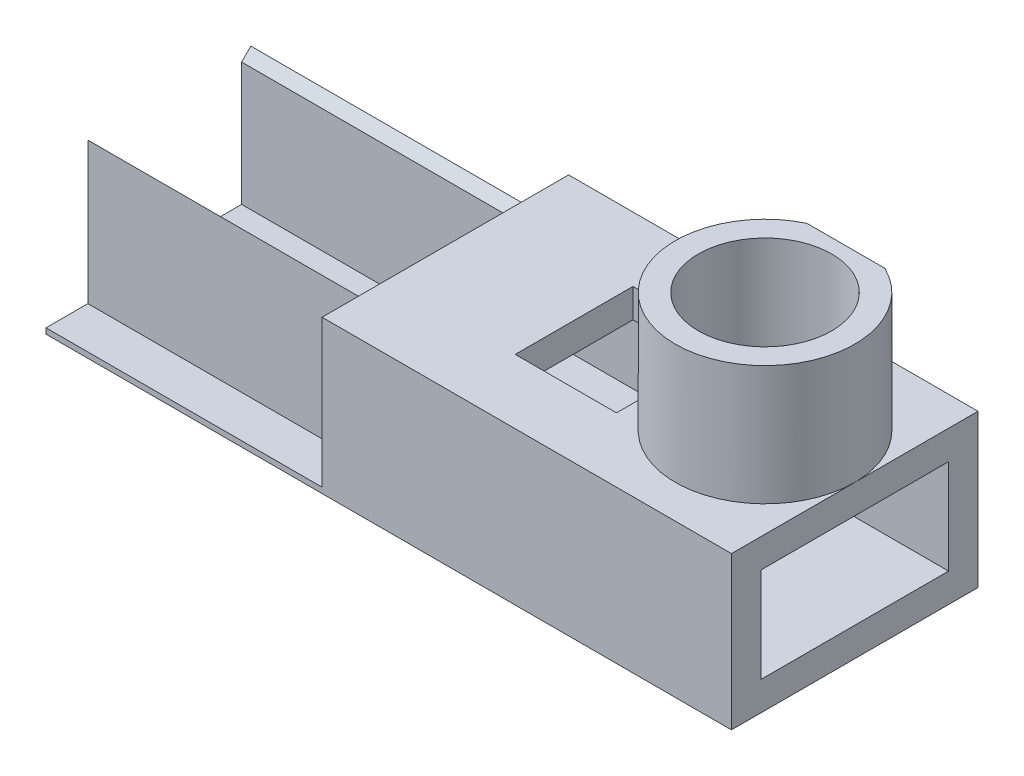
ISO-10303-21;
HEADER;
FILE_DESCRIPTION(('STEP AP214'),'2;1');
FILE_NAME('part.step','',(''),(''),'','','');
FILE_SCHEMA(('AUTOMOTIVE_DESIGN { 1 0 10303 214 1 1 1 1 }'));
ENDSEC;
DATA;
#1=APPLICATION_CONTEXT('core data for automotive mechanical design processes');
#2=APPLICATION_PROTOCOL_DEFINITION('international standard','automotive_design',2000,#1);
#3=PRODUCT_CONTEXT('',#1,'mechanical');
#4=PRODUCT('Part','Part','',(#3));
#5=PRODUCT_RELATED_PRODUCT_CATEGORY('part','',(#4));
#6=PRODUCT_DEFINITION_FORMATION('','',#4);
#7=PRODUCT_DEFINITION_CONTEXT('part definition',#1,'design');
#8=PRODUCT_DEFINITION('design','',#6,#7);
#9=PRODUCT_DEFINITION_SHAPE('','',#8);
#10=(LENGTH_UNIT() NAMED_UNIT(*) SI_UNIT(.MILLI.,.METRE.));
#11=(NAMED_UNIT(*) PLANE_ANGLE_UNIT() SI_UNIT($,.RADIAN.));
#12=(NAMED_UNIT(*) SI_UNIT($,.STERADIAN.) SOLID_ANGLE_UNIT());
#13=UNCERTAINTY_MEASURE_WITH_UNIT(LENGTH_MEASURE(1.E-05),#10,'distance_accuracy_value','');
#14=(GEOMETRIC_REPRESENTATION_CONTEXT(3) GLOBAL_UNCERTAINTY_ASSIGNED_CONTEXT((#13)) GLOBAL_UNIT_ASSIGNED_CONTEXT((#10,
#11,#12)) REPRESENTATION_CONTEXT('',''));
#15=CARTESIAN_POINT('',(0.,0.,0.));
#16=DIRECTION('',(0.,0.,1.));
#17=DIRECTION('',(1.,0.,0.));
#18=AXIS2_PLACEMENT_3D('',#15,#16,#17);
#19=CARTESIAN_POINT('',(19.5,10.5957838415425,-19.2114942528736));
#20=DIRECTION('',(0.,1.,0.));
#21=DIRECTION('',(0.,0.,1.));
#22=AXIS2_PLACEMENT_3D('',#19,#20,#21);
#23=PLANE('',#22);
#24=CARTESIAN_POINT('',(9.75,10.5957838415425,-9.01149425287356));
#25=DIRECTION('',(0.,1.,0.));
#26=DIRECTION('',(0.,0.,1.));
#27=AXIS2_PLACEMENT_3D('',#24,#25,#26);
#28=CIRCLE('',#27,7.2482741471671);
#29=CARTESIAN_POINT('',(9.75,10.5957838415425,-1.76322010570646));
#30=VERTEX_POINT('',#29);
#31=EDGE_CURVE('E301',#30,#30,#28,.T.);
#32=ORIENTED_EDGE('',*,*,#31,.T.);
#33=EDGE_LOOP('',(#32));
#34=FACE_BOUND('',#33,.T.);
#35=DIRECTION('',(1.,0.,0.));
#36=VECTOR('',#35,1.);
#37=CARTESIAN_POINT('',(19.5,10.5957838415425,-2.61149425287356));
#38=LINE('',#37,#36);
#39=CARTESIAN_POINT('',(-11.0041079388008,10.5957838415425,-2.61149425287356));
#40=VERTEX_POINT('',#39);
#41=CARTESIAN_POINT('',(0.,10.5957838415425,-2.61149425287356));
#42=VERTEX_POINT('',#41);
#43=EDGE_CURVE('E311',#40,#42,#38,.T.);
#44=ORIENTED_EDGE('',*,*,#43,.T.);
#45=DIRECTION('',(0.,0.,-1.));
#46=VECTOR('',#45,1.);
#47=CARTESIAN_POINT('',(0.,10.5957838415425,-19.2114942528736));
#48=LINE('',#47,#46);
#49=CARTESIAN_POINT('',(0.,10.5957838415425,-15.4114942528736));
#50=VERTEX_POINT('',#49);
#51=EDGE_CURVE('E314',#42,#50,#48,.T.);
#52=ORIENTED_EDGE('',*,*,#51,.T.);
#53=DIRECTION('',(-1.,0.,0.));
#54=VECTOR('',#53,1.);
#55=CARTESIAN_POINT('',(19.5,10.5957838415425,-15.4114942528736));
#56=LINE('',#55,#54);
#57=CARTESIAN_POINT('',(-11.0041079388008,10.5957838415425,-15.4114942528736));
#58=VERTEX_POINT('',#57);
#59=EDGE_CURVE('E278',#50,#58,#56,.T.);
#60=ORIENTED_EDGE('',*,*,#59,.T.);
#61=DIRECTION('',(0.,0.,1.));
#62=VECTOR('',#61,1.);
#63=CARTESIAN_POINT('',(-11.0041079388008,10.5957838415425,-19.2114942528736));
#64=LINE('',#63,#62);
#65=EDGE_CURVE('E308',#58,#40,#64,.T.);
#66=ORIENTED_EDGE('',*,*,#65,.T.);
#67=EDGE_LOOP('',(#44,#52,#60,#66));
#68=FACE_BOUND('',#67,.T.);
#69=DIRECTION('',(-1.,0.,0.));
#70=VECTOR('',#69,1.);
#71=CARTESIAN_POINT('',(-19.,10.5957838415425,-13.3022949952942));
#72=LINE('',#71,#70);
#73=CARTESIAN_POINT('',(-24.,10.5957838415425,-13.3022949952942));
#74=VERTEX_POINT('',#73);
#75=CARTESIAN_POINT('',(-19.,10.5957838415425,-13.3022949952942));
#76=VERTEX_POINT('',#75);
#77=EDGE_CURVE('E586',#74,#76,#72,.F.);
#78=ORIENTED_EDGE('',*,*,#77,.F.);
#79=DIRECTION('',(0.,0.,-1.));
#80=VECTOR('',#79,1.);
#81=CARTESIAN_POINT('',(-24.,10.5957838415425,-19.2114942528736));
#82=LINE('',#81,#80);
#83=CARTESIAN_POINT('',(-24.,10.5957838415425,-19.2114942528736));
#84=VERTEX_POINT('',#83);
#85=EDGE_CURVE('E532',#74,#84,#82,.T.);
#86=ORIENTED_EDGE('',*,*,#85,.T.);
#87=DIRECTION('',(-1.,0.,0.));
#88=VECTOR('',#87,1.);
#89=CARTESIAN_POINT('',(19.5,10.5957838415425,-19.2114942528736));
#90=LINE('',#89,#88);
#91=CARTESIAN_POINT('',(19.5,10.5957838415425,-19.2114942528736));
#92=VERTEX_POINT('',#91);
#93=EDGE_CURVE('E300',#92,#84,#90,.T.);
#94=ORIENTED_EDGE('',*,*,#93,.F.);
#95=DIRECTION('',(0.,0.,-1.));
#96=VECTOR('',#95,1.);
#97=CARTESIAN_POINT('',(19.5,10.5957838415425,-19.2114942528736));
#98=LINE('',#97,#96);
#99=CARTESIAN_POINT('',(19.5,10.5957838415425,1.18850574712644));
#100=VERTEX_POINT('',#99);
#101=EDGE_CURVE('E546',#100,#92,#98,.T.);
#102=ORIENTED_EDGE('',*,*,#101,.F.);
#103=DIRECTION('',(-1.,0.,0.));
#104=VECTOR('',#103,1.);
#105=CARTESIAN_POINT('',(19.5,10.5957838415425,1.18850574712644));
#106=LINE('',#105,#104);
#107=CARTESIAN_POINT('',(-24.,10.5957838415425,1.18850574712644));
#108=VERTEX_POINT('',#107);
#109=EDGE_CURVE('E552',#100,#108,#106,.T.);
#110=ORIENTED_EDGE('',*,*,#109,.T.);
#111=CARTESIAN_POINT('',(-24.,10.5957838415425,-4.72069351045292));
#112=VERTEX_POINT('',#111);
#113=EDGE_CURVE('E305',#108,#112,#82,.T.);
#114=ORIENTED_EDGE('',*,*,#113,.T.);
#115=DIRECTION('',(-1.,0.,0.));
#116=VECTOR('',#115,1.);
#117=CARTESIAN_POINT('',(-19.,10.5957838415425,-4.72069351045292));
#118=LINE('',#117,#116);
#119=CARTESIAN_POINT('',(-19.,10.5957838415425,-4.72069351045292));
#120=VERTEX_POINT('',#119);
#121=EDGE_CURVE('E581',#120,#112,#118,.T.);
#122=ORIENTED_EDGE('',*,*,#121,.F.);
#123=DIRECTION('',(0.,0.,-1.));
#124=VECTOR('',#123,1.);
#125=CARTESIAN_POINT('',(-19.,10.5957838415425,-19.2114942528736));
#126=LINE('',#125,#124);
#127=EDGE_CURVE('E420',#120,#76,#126,.T.);
#128=ORIENTED_EDGE('',*,*,#127,.T.);
#129=EDGE_LOOP('',(#78,#86,#94,#102,#110,#114,#122,#128));
#130=FACE_BOUND('',#129,.T.);
#131=ADVANCED_FACE('F61',(#34,#68,#130),#23,.F.);
#132=CARTESIAN_POINT('',(19.5,0.29578384154251,-19.2114942528736));
#133=DIRECTION('',(0.,-1.,0.));
#134=DIRECTION('',(0.,0.,-1.));
#135=AXIS2_PLACEMENT_3D('',#132,#133,#134);
#136=PLANE('',#135);
#137=CARTESIAN_POINT('',(-1.24245959291602,0.29578384154251,-9.01149425287356));
#138=DIRECTION('',(0.,-1.,0.));
#139=DIRECTION('',(0.,0.,-1.));
#140=AXIS2_PLACEMENT_3D('',#137,#138,#139);
#141=CIRCLE('',#140,10.);
#142=CARTESIAN_POINT('',(-1.24245959291602,0.29578384154251,-19.0114942528736));
#143=VERTEX_POINT('',#142);
#144=EDGE_CURVE('E317',#143,#143,#141,.T.);
#145=ORIENTED_EDGE('',*,*,#144,.T.);
#146=EDGE_LOOP('',(#145));
#147=FACE_BOUND('',#146,.T.);
#148=DIRECTION('',(-1.,0.,0.));
#149=VECTOR('',#148,1.);
#150=CARTESIAN_POINT('',(-19.,0.29578384154251,-4.72069351045292));
#151=LINE('',#150,#149);
#152=CARTESIAN_POINT('',(-24.,0.29578384154251,-4.72069351045292));
#153=VERTEX_POINT('',#152);
#154=CARTESIAN_POINT('',(-19.,0.29578384154251,-4.72069351045292));
#155=VERTEX_POINT('',#154);
#156=EDGE_CURVE('E578',#153,#155,#151,.F.);
#157=ORIENTED_EDGE('',*,*,#156,.F.);
#158=DIRECTION('',(0.,0.,1.));
#159=VECTOR('',#158,1.);
#160=CARTESIAN_POINT('',(-24.,0.29578384154251,-19.2114942528736));
#161=LINE('',#160,#159);
#162=CARTESIAN_POINT('',(-24.,0.29578384154251,1.18850574712644));
#163=VERTEX_POINT('',#162);
#164=EDGE_CURVE('E525',#153,#163,#161,.T.);
#165=ORIENTED_EDGE('',*,*,#164,.T.);
#166=DIRECTION('',(-1.,0.,0.));
#167=VECTOR('',#166,1.);
#168=CARTESIAN_POINT('',(19.5,0.29578384154251,1.18850574712644));
#169=LINE('',#168,#167);
#170=CARTESIAN_POINT('',(19.5,0.29578384154251,1.18850574712644));
#171=VERTEX_POINT('',#170);
#172=EDGE_CURVE('E555',#171,#163,#169,.T.);
#173=ORIENTED_EDGE('',*,*,#172,.F.);
#174=DIRECTION('',(0.,0.,1.));
#175=VECTOR('',#174,1.);
#176=CARTESIAN_POINT('',(19.5,0.29578384154251,-19.2114942528736));
#177=LINE('',#176,#175);
#178=CARTESIAN_POINT('',(19.5,0.29578384154251,-19.2114942528736));
#179=VERTEX_POINT('',#178);
#180=EDGE_CURVE('E540',#179,#171,#177,.T.);
#181=ORIENTED_EDGE('',*,*,#180,.F.);
#182=DIRECTION('',(-1.,0.,0.));
#183=VECTOR('',#182,1.);
#184=CARTESIAN_POINT('',(19.5,0.29578384154251,-19.2114942528736));
#185=LINE('',#184,#183);
#186=CARTESIAN_POINT('',(-24.,0.29578384154251,-19.2114942528736));
#187=VERTEX_POINT('',#186);
#188=EDGE_CURVE('E549',#179,#187,#185,.T.);
#189=ORIENTED_EDGE('',*,*,#188,.T.);
#190=CARTESIAN_POINT('',(-24.,0.29578384154251,-13.3022949952942));
#191=VERTEX_POINT('',#190);
#192=EDGE_CURVE('E526',#187,#191,#161,.T.);
#193=ORIENTED_EDGE('',*,*,#192,.T.);
#194=DIRECTION('',(-1.,0.,0.));
#195=VECTOR('',#194,1.);
#196=CARTESIAN_POINT('',(-19.,0.29578384154251,-13.3022949952942));
#197=LINE('',#196,#195);
#198=CARTESIAN_POINT('',(-19.,0.29578384154251,-13.3022949952942));
#199=VERTEX_POINT('',#198);
#200=EDGE_CURVE('E574',#199,#191,#197,.T.);
#201=ORIENTED_EDGE('',*,*,#200,.F.);
#202=DIRECTION('',(0.,0.,1.));
#203=VECTOR('',#202,1.);
#204=CARTESIAN_POINT('',(-19.,0.29578384154251,-19.2114942528736));
#205=LINE('',#204,#203);
#206=EDGE_CURVE('E323',#199,#155,#205,.T.);
#207=ORIENTED_EDGE('',*,*,#206,.T.);
#208=EDGE_LOOP('',(#157,#165,#173,#181,#189,#193,#201,#207));
#209=FACE_BOUND('',#208,.T.);
#210=ADVANCED_FACE('F336',(#147,#209),#136,.F.);
#211=CARTESIAN_POINT('',(19.5,0.,0.));
#212=DIRECTION('',(-1.,0.,0.));
#213=DIRECTION('',(0.,0.,1.));
#214=AXIS2_PLACEMENT_3D('',#211,#212,#213);
#215=PLANE('',#214);
#216=DIRECTION('',(0.,0.,-1.));
#217=VECTOR('',#216,1.);
#218=CARTESIAN_POINT('',(19.5,-2.85421615845749,4.38850574712644));
#219=LINE('',#218,#217);
#220=CARTESIAN_POINT('',(19.5,-2.85421615845749,4.38850574712644));
#221=VERTEX_POINT('',#220);
#222=CARTESIAN_POINT('',(19.5,-2.85421615845749,-22.4114942528736));
#223=VERTEX_POINT('',#222);
#224=EDGE_CURVE('E266',#221,#223,#219,.T.);
#225=ORIENTED_EDGE('',*,*,#224,.T.);
#226=DIRECTION('',(0.,-1.,0.));
#227=VECTOR('',#226,1.);
#228=CARTESIAN_POINT('',(19.5,13.7457838415425,-22.4114942528736));
#229=LINE('',#228,#227);
#230=CARTESIAN_POINT('',(19.5,13.7457838415425,-22.4114942528736));
#231=VERTEX_POINT('',#230);
#232=EDGE_CURVE('E269',#231,#223,#229,.T.);
#233=ORIENTED_EDGE('',*,*,#232,.F.);
#234=DIRECTION('',(0.,0.,-1.));
#235=VECTOR('',#234,1.);
#236=CARTESIAN_POINT('',(19.5,13.7457838415425,4.38850574712644));
#237=LINE('',#236,#235);
#238=CARTESIAN_POINT('',(19.5,13.7457838415425,-9.01149425287356));
#239=VERTEX_POINT('',#238);
#240=EDGE_CURVE('E283',#239,#231,#237,.T.);
#241=ORIENTED_EDGE('',*,*,#240,.F.);
#242=CARTESIAN_POINT('',(19.5,13.7457838415425,4.38850574712644));
#243=VERTEX_POINT('',#242);
#244=EDGE_CURVE('E284',#243,#239,#237,.T.);
#245=ORIENTED_EDGE('',*,*,#244,.F.);
#246=DIRECTION('',(0.,-1.,0.));
#247=VECTOR('',#246,1.);
#248=CARTESIAN_POINT('',(19.5,13.7457838415425,4.38850574712644));
#249=LINE('',#248,#247);
#250=EDGE_CURVE('E287',#243,#221,#249,.T.);
#251=ORIENTED_EDGE('',*,*,#250,.T.);
#252=EDGE_LOOP('',(#225,#233,#241,#245,#251));
#253=FACE_BOUND('',#252,.T.);
#254=ORIENTED_EDGE('',*,*,#101,.T.);
#255=DIRECTION('',(0.,-1.,0.));
#256=VECTOR('',#255,1.);
#257=CARTESIAN_POINT('',(19.5,10.5957838415425,-19.2114942528736));
#258=LINE('',#257,#256);
#259=EDGE_CURVE('E537',#92,#179,#258,.T.);
#260=ORIENTED_EDGE('',*,*,#259,.T.);
#261=ORIENTED_EDGE('',*,*,#180,.T.);
#262=DIRECTION('',(0.,1.,0.));
#263=VECTOR('',#262,1.);
#264=CARTESIAN_POINT('',(19.5,10.5957838415425,1.18850574712644));
#265=LINE('',#264,#263);
#266=EDGE_CURVE('E543',#171,#100,#265,.T.);
#267=ORIENTED_EDGE('',*,*,#266,.T.);
#268=EDGE_LOOP('',(#254,#260,#261,#267));
#269=FACE_BOUND('',#268,.T.);
#270=ADVANCED_FACE('F342',(#253,#269),#215,.F.);
#271=CARTESIAN_POINT('',(19.5,-2.85421615845749,4.38850574712644));
#272=DIRECTION('',(0.,1.,0.));
#273=DIRECTION('',(0.,0.,1.));
#274=AXIS2_PLACEMENT_3D('',#271,#272,#273);
#275=PLANE('',#274);
#276=CARTESIAN_POINT('',(-1.24245959291602,-2.85421615845749,-9.01149425287356));
#277=DIRECTION('',(0.,-1.,0.));
#278=DIRECTION('',(0.,0.,-1.));
#279=AXIS2_PLACEMENT_3D('',#276,#277,#278);
#280=CIRCLE('',#279,8.);
#281=CARTESIAN_POINT('',(-1.24245959291602,-2.85421615845749,-17.0114942528736));
#282=VERTEX_POINT('',#281);
#283=EDGE_CURVE('E392',#282,#282,#280,.T.);
#284=ORIENTED_EDGE('',*,*,#283,.F.);
#285=EDGE_LOOP('',(#284));
#286=FACE_BOUND('',#285,.T.);
#287=DIRECTION('',(-1.,0.,0.));
#288=VECTOR('',#287,1.);
#289=CARTESIAN_POINT('',(19.5,-2.85421615845749,4.38850574712644));
#290=LINE('',#289,#288);
#291=CARTESIAN_POINT('',(-55.0112617718967,-2.85421615845749,4.38850574712643));
#292=VERTEX_POINT('',#291);
#293=EDGE_CURVE('E289',#221,#292,#290,.T.);
#294=ORIENTED_EDGE('',*,*,#293,.T.);
#295=DIRECTION('',(0.,0.,-1.));
#296=VECTOR('',#295,1.);
#297=CARTESIAN_POINT('',(-55.0112617718967,-2.85421615845749,4.38850574712643));
#298=LINE('',#297,#296);
#299=CARTESIAN_POINT('',(-55.0112617718967,-2.85421615845749,-22.4114942528736));
#300=VERTEX_POINT('',#299);
#301=EDGE_CURVE('E399',#292,#300,#298,.T.);
#302=ORIENTED_EDGE('',*,*,#301,.T.);
#303=DIRECTION('',(-1.,0.,0.));
#304=VECTOR('',#303,1.);
#305=CARTESIAN_POINT('',(19.5,-2.85421615845749,-22.4114942528736));
#306=LINE('',#305,#304);
#307=EDGE_CURVE('E296',#223,#300,#306,.T.);
#308=ORIENTED_EDGE('',*,*,#307,.F.);
#309=ORIENTED_EDGE('',*,*,#224,.F.);
#310=EDGE_LOOP('',(#294,#302,#308,#309));
#311=FACE_BOUND('',#310,.T.);
#312=ADVANCED_FACE('F373',(#286,#311),#275,.F.);
#313=CARTESIAN_POINT('',(19.5,13.7457838415425,-22.4114942528736));
#314=DIRECTION('',(0.,0.,-1.));
#315=DIRECTION('',(0.,1.,0.));
#316=AXIS2_PLACEMENT_3D('',#313,#314,#315);
#317=PLANE('',#316);
#318=ORIENTED_EDGE('',*,*,#307,.T.);
#319=DIRECTION('',(0.,1.,0.));
#320=VECTOR('',#319,1.);
#321=CARTESIAN_POINT('',(-55.0112617718967,-2.85421615845749,-22.4114942528736));
#322=LINE('',#321,#320);
#323=CARTESIAN_POINT('',(-55.0112617718967,-2.25421615845749,-22.4114942528736));
#324=VERTEX_POINT('',#323);
#325=EDGE_CURVE('E409',#300,#324,#322,.T.);
#326=ORIENTED_EDGE('',*,*,#325,.T.);
#327=DIRECTION('',(1.,0.,0.));
#328=VECTOR('',#327,1.);
#329=CARTESIAN_POINT('',(-25.,-2.25421615845749,-22.4114942528736));
#330=LINE('',#329,#328);
#331=CARTESIAN_POINT('',(-25.,-2.25421615845749,-22.4114942528736));
#332=VERTEX_POINT('',#331);
#333=EDGE_CURVE('E413',#324,#332,#330,.T.);
#334=ORIENTED_EDGE('',*,*,#333,.T.);
#335=DIRECTION('',(0.,-1.,0.));
#336=VECTOR('',#335,1.);
#337=CARTESIAN_POINT('',(-25.,13.7457838415425,-22.4114942528736));
#338=LINE('',#337,#336);
#339=CARTESIAN_POINT('',(-25.,13.7457838415425,-22.4114942528736));
#340=VERTEX_POINT('',#339);
#341=EDGE_CURVE('E491',#340,#332,#338,.T.);
#342=ORIENTED_EDGE('',*,*,#341,.F.);
#343=DIRECTION('',(-1.,0.,0.));
#344=VECTOR('',#343,1.);
#345=CARTESIAN_POINT('',(19.5,13.7457838415425,-22.4114942528736));
#346=LINE('',#345,#344);
#347=EDGE_CURVE('E294',#231,#340,#346,.T.);
#348=ORIENTED_EDGE('',*,*,#347,.F.);
#349=ORIENTED_EDGE('',*,*,#232,.T.);
#350=EDGE_LOOP('',(#318,#326,#334,#342,#348,#349));
#351=FACE_BOUND('',#350,.T.);
#352=ADVANCED_FACE('F381',(#351),#317,.T.);
#353=CARTESIAN_POINT('',(19.5,13.7457838415425,4.38850574712644));
#354=DIRECTION('',(0.,1.,0.));
#355=DIRECTION('',(0.,0.,1.));
#356=AXIS2_PLACEMENT_3D('',#353,#354,#355);
#357=PLANE('',#356);
#358=DIRECTION('',(0.,0.,-1.));
#359=VECTOR('',#358,1.);
#360=CARTESIAN_POINT('',(0.,13.7457838415425,-15.4114942528736));
#361=LINE('',#360,#359);
#362=CARTESIAN_POINT('',(0.,13.7457838415425,-2.61149425287356));
#363=VERTEX_POINT('',#362);
#364=CARTESIAN_POINT('',(0.,13.7457838415425,-9.01149425287355));
#365=VERTEX_POINT('',#364);
#366=EDGE_CURVE('E502',#363,#365,#361,.T.);
#367=ORIENTED_EDGE('',*,*,#366,.F.);
#368=DIRECTION('',(1.,0.,0.));
#369=VECTOR('',#368,1.);
#370=CARTESIAN_POINT('',(0.,13.7457838415425,-2.61149425287356));
#371=LINE('',#370,#369);
#372=CARTESIAN_POINT('',(-11.0041079388008,13.7457838415425,-2.61149425287356));
#373=VERTEX_POINT('',#372);
#374=EDGE_CURVE('E510',#373,#363,#371,.T.);
#375=ORIENTED_EDGE('',*,*,#374,.F.);
#376=DIRECTION('',(0.,0.,1.));
#377=VECTOR('',#376,1.);
#378=CARTESIAN_POINT('',(-11.0041079388008,13.7457838415425,-15.4114942528736));
#379=LINE('',#378,#377);
#380=CARTESIAN_POINT('',(-11.0041079388008,13.7457838415425,-15.4114942528736));
#381=VERTEX_POINT('',#380);
#382=EDGE_CURVE('E507',#381,#373,#379,.T.);
#383=ORIENTED_EDGE('',*,*,#382,.F.);
#384=DIRECTION('',(-1.,0.,0.));
#385=VECTOR('',#384,1.);
#386=CARTESIAN_POINT('',(0.,13.7457838415425,-15.4114942528736));
#387=LINE('',#386,#385);
#388=CARTESIAN_POINT('',(0.,13.7457838415425,-15.4114942528736));
#389=VERTEX_POINT('',#388);
#390=EDGE_CURVE('E504',#389,#381,#387,.T.);
#391=ORIENTED_EDGE('',*,*,#390,.F.);
#392=EDGE_CURVE('E501',#365,#389,#361,.T.);
#393=ORIENTED_EDGE('',*,*,#392,.F.);
#394=CARTESIAN_POINT('',(9.75,13.7457838415425,-9.01149425287356));
#395=DIRECTION('',(0.,1.,0.));
#396=DIRECTION('',(0.,0.,1.));
#397=AXIS2_PLACEMENT_3D('',#394,#395,#396);
#398=CIRCLE('',#397,9.75);
#399=EDGE_CURVE('E276',#239,#365,#398,.T.);
#400=ORIENTED_EDGE('',*,*,#399,.F.);
#401=ORIENTED_EDGE('',*,*,#240,.T.);
#402=ORIENTED_EDGE('',*,*,#347,.T.);
#403=DIRECTION('',(0.,0.,-1.));
#404=VECTOR('',#403,1.);
#405=CARTESIAN_POINT('',(-25.,13.7457838415425,-22.4114942528736));
#406=LINE('',#405,#404);
#407=CARTESIAN_POINT('',(-25.,13.7457838415425,4.38850574712643));
#408=VERTEX_POINT('',#407);
#409=EDGE_CURVE('E498',#408,#340,#406,.T.);
#410=ORIENTED_EDGE('',*,*,#409,.F.);
#411=DIRECTION('',(-1.,0.,0.));
#412=VECTOR('',#411,1.);
#413=CARTESIAN_POINT('',(19.5,13.7457838415425,4.38850574712644));
#414=LINE('',#413,#412);
#415=EDGE_CURVE('E291',#243,#408,#414,.T.);
#416=ORIENTED_EDGE('',*,*,#415,.F.);
#417=ORIENTED_EDGE('',*,*,#244,.T.);
#418=EDGE_CURVE('E279',#365,#239,#398,.T.);
#419=ORIENTED_EDGE('',*,*,#418,.F.);
#420=EDGE_LOOP('',(#367,#375,#383,#391,#393,#400,#401,#402,#410,#416,#417,#419));
#421=FACE_BOUND('',#420,.T.);
#422=ADVANCED_FACE('F377',(#421),#357,.T.);
#423=CARTESIAN_POINT('',(19.5,13.7457838415425,4.38850574712644));
#424=DIRECTION('',(0.,0.,-1.));
#425=DIRECTION('',(0.,1.,0.));
#426=AXIS2_PLACEMENT_3D('',#423,#424,#425);
#427=PLANE('',#426);
#428=ORIENTED_EDGE('',*,*,#415,.T.);
#429=DIRECTION('',(0.,1.,0.));
#430=VECTOR('',#429,1.);
#431=CARTESIAN_POINT('',(-25.,13.7457838415425,4.38850574712643));
#432=LINE('',#431,#430);
#433=CARTESIAN_POINT('',(-25.,-2.25421615845749,4.38850574712644));
#434=VERTEX_POINT('',#433);
#435=EDGE_CURVE('E496',#434,#408,#432,.T.);
#436=ORIENTED_EDGE('',*,*,#435,.F.);
#437=DIRECTION('',(-1.,0.,0.));
#438=VECTOR('',#437,1.);
#439=CARTESIAN_POINT('',(-25.,-2.25421615845749,4.38850574712644));
#440=LINE('',#439,#438);
#441=CARTESIAN_POINT('',(-55.0112617718967,-2.25421615845749,4.38850574712643));
#442=VERTEX_POINT('',#441);
#443=EDGE_CURVE('E405',#434,#442,#440,.T.);
#444=ORIENTED_EDGE('',*,*,#443,.T.);
#445=DIRECTION('',(0.,1.,0.));
#446=VECTOR('',#445,1.);
#447=CARTESIAN_POINT('',(-55.0112617718967,-2.85421615845749,4.38850574712643));
#448=LINE('',#447,#446);
#449=EDGE_CURVE('E403',#292,#442,#448,.T.);
#450=ORIENTED_EDGE('',*,*,#449,.F.);
#451=ORIENTED_EDGE('',*,*,#293,.F.);
#452=ORIENTED_EDGE('',*,*,#250,.F.);
#453=EDGE_LOOP('',(#428,#436,#444,#450,#451,#452));
#454=FACE_BOUND('',#453,.T.);
#455=ADVANCED_FACE('F368',(#454),#427,.F.);
#456=CARTESIAN_POINT('',(9.75,26.7562663294774,-9.01149425287356));
#457=DIRECTION('',(0.,1.,0.));
#458=DIRECTION('',(0.,0.,1.));
#459=AXIS2_PLACEMENT_3D('',#456,#457,#458);
#460=PLANE('',#459);
#461=DIRECTION('',(1.,0.,0.));
#462=VECTOR('',#461,1.);
#463=CARTESIAN_POINT('',(0.,26.7562663294774,-17.7942021687245));
#464=LINE('',#463,#462);
#465=CARTESIAN_POINT('',(5.51602531126493,26.7562663294774,-17.7942021687245));
#466=VERTEX_POINT('',#465);
#467=CARTESIAN_POINT('',(13.9839746887351,26.7562663294774,-17.7942021687245));
#468=VERTEX_POINT('',#467);
#469=EDGE_CURVE('E253',#466,#468,#464,.T.);
#470=ORIENTED_EDGE('',*,*,#469,.F.);
#471=CARTESIAN_POINT('',(9.75,26.7562663294774,-9.01149425287356));
#472=DIRECTION('',(0.,1.,0.));
#473=DIRECTION('',(0.,0.,1.));
#474=AXIS2_PLACEMENT_3D('',#471,#472,#473);
#475=CIRCLE('',#474,9.75);
#476=EDGE_CURVE('E262',#466,#468,#475,.T.);
#477=ORIENTED_EDGE('',*,*,#476,.T.);
#478=EDGE_LOOP('',(#470,#477));
#479=FACE_BOUND('',#478,.T.);
#480=CARTESIAN_POINT('',(9.75,26.7562663294774,-9.01149425287356));
#481=DIRECTION('',(0.,1.,0.));
#482=DIRECTION('',(0.,0.,1.));
#483=AXIS2_PLACEMENT_3D('',#480,#481,#482);
#484=CIRCLE('',#483,7.25);
#485=CARTESIAN_POINT('',(9.75,26.7562663294774,-1.76149425287356));
#486=VERTEX_POINT('',#485);
#487=EDGE_CURVE('E267',#486,#486,#484,.T.);
#488=ORIENTED_EDGE('',*,*,#487,.F.);
#489=EDGE_LOOP('',(#488));
#490=FACE_BOUND('',#489,.T.);
#491=ADVANCED_FACE('F260',(#479,#490),#460,.T.);
#492=CARTESIAN_POINT('',(9.75,26.7562663294774,-9.01149425287356));
#493=DIRECTION('',(0.,-1.,0.));
#494=DIRECTION('',(0.,0.,-1.));
#495=AXIS2_PLACEMENT_3D('',#492,#493,#494);
#496=CYLINDRICAL_SURFACE('',#495,9.75);
#497=ORIENTED_EDGE('',*,*,#476,.F.);
#498=DIRECTION('',(0.,-1.,0.));
#499=VECTOR('',#498,1.);
#500=CARTESIAN_POINT('',(5.51602531126493,26.7562663294774,-17.7942021687245));
#501=LINE('',#500,#499);
#502=CARTESIAN_POINT('',(5.51602531126493,13.7462663294774,-17.7942021687245));
#503=VERTEX_POINT('',#502);
#504=EDGE_CURVE('E12',#466,#503,#501,.T.);
#505=ORIENTED_EDGE('',*,*,#504,.T.);
#506=CARTESIAN_POINT('',(9.75,13.7462663294774,-9.01149425287356));
#507=DIRECTION('',(0.,1.,0.));
#508=DIRECTION('',(0.,0.,1.));
#509=AXIS2_PLACEMENT_3D('',#506,#507,#508);
#510=CIRCLE('',#509,9.75);
#511=CARTESIAN_POINT('',(13.9839746887351,13.7462663294774,-17.7942021687245));
#512=VERTEX_POINT('',#511);
#513=EDGE_CURVE('E326',#512,#503,#510,.T.);
#514=ORIENTED_EDGE('',*,*,#513,.F.);
#515=DIRECTION('',(0.,-1.,0.));
#516=VECTOR('',#515,1.);
#517=CARTESIAN_POINT('',(13.9839746887351,26.7562663294774,-17.7942021687245));
#518=LINE('',#517,#516);
#519=EDGE_CURVE('E70',#512,#468,#518,.F.);
#520=ORIENTED_EDGE('',*,*,#519,.T.);
#521=EDGE_LOOP('',(#497,#505,#514,#520));
#522=FACE_BOUND('',#521,.T.);
#523=ORIENTED_EDGE('',*,*,#399,.T.);
#524=ORIENTED_EDGE('',*,*,#418,.T.);
#525=EDGE_LOOP('',(#523,#524));
#526=FACE_BOUND('',#525,.T.);
#527=ADVANCED_FACE('F264',(#522,#526),#496,.T.);
#528=CARTESIAN_POINT('',(9.75,26.7562663294774,-9.01149425287356));
#529=DIRECTION('',(0.,-1.,0.));
#530=DIRECTION('',(0.,0.,-1.));
#531=AXIS2_PLACEMENT_3D('',#528,#529,#530);
#532=CYLINDRICAL_SURFACE('',#531,7.25);
#533=ORIENTED_EDGE('',*,*,#487,.T.);
#534=EDGE_LOOP('',(#533));
#535=FACE_BOUND('',#534,.T.);
#536=CARTESIAN_POINT('',(9.75,10.7457838415425,-9.01149425287356));
#537=DIRECTION('',(0.,1.,0.));
#538=DIRECTION('',(0.,0.,1.));
#539=AXIS2_PLACEMENT_3D('',#536,#537,#538);
#540=CIRCLE('',#539,7.25);
#541=CARTESIAN_POINT('',(9.75,10.7457838415425,-1.76149425287355));
#542=VERTEX_POINT('',#541);
#543=EDGE_CURVE('E272',#542,#542,#540,.T.);
#544=ORIENTED_EDGE('',*,*,#543,.F.);
#545=EDGE_LOOP('',(#544));
#546=FACE_BOUND('',#545,.T.);
#547=ADVANCED_FACE('F361',(#535,#546),#532,.F.);
#548=CARTESIAN_POINT('',(19.5,10.7457838415425,-19.4114942528736));
#549=DIRECTION('',(0.,1.,0.));
#550=DIRECTION('',(0.,0.,1.));
#551=AXIS2_PLACEMENT_3D('',#548,#549,#550);
#552=PLANE('',#551);
#553=CARTESIAN_POINT('',(9.75,10.7457838415425,-9.01149425287356));
#554=DIRECTION('',(0.,1.,0.));
#555=DIRECTION('',(0.,0.,1.));
#556=AXIS2_PLACEMENT_3D('',#553,#554,#555);
#557=CIRCLE('',#556,7.2482741471671);
#558=CARTESIAN_POINT('',(9.75,10.7457838415425,-1.76322010570646));
#559=VERTEX_POINT('',#558);
#560=EDGE_CURVE('E304',#559,#559,#557,.T.);
#561=ORIENTED_EDGE('',*,*,#560,.F.);
#562=EDGE_LOOP('',(#561));
#563=FACE_BOUND('',#562,.T.);
#564=ORIENTED_EDGE('',*,*,#543,.T.);
#565=EDGE_LOOP('',(#564));
#566=FACE_BOUND('',#565,.T.);
#567=ADVANCED_FACE('F357',(#563,#566),#552,.T.);
#568=CARTESIAN_POINT('',(19.5,10.5957838415425,-19.2114942528736));
#569=DIRECTION('',(0.,0.,-1.));
#570=DIRECTION('',(-1.,0.,0.));
#571=AXIS2_PLACEMENT_3D('',#568,#569,#570);
#572=PLANE('',#571);
#573=ORIENTED_EDGE('',*,*,#93,.T.);
#574=DIRECTION('',(0.,-1.,0.));
#575=VECTOR('',#574,1.);
#576=CARTESIAN_POINT('',(-24.,10.5957838415425,-19.2114942528736));
#577=LINE('',#576,#575);
#578=EDGE_CURVE('E522',#84,#187,#577,.T.);
#579=ORIENTED_EDGE('',*,*,#578,.T.);
#580=ORIENTED_EDGE('',*,*,#188,.F.);
#581=ORIENTED_EDGE('',*,*,#259,.F.);
#582=EDGE_LOOP('',(#573,#579,#580,#581));
#583=FACE_BOUND('',#582,.T.);
#584=ADVANCED_FACE('F352',(#583),#572,.F.);
#585=CARTESIAN_POINT('',(19.5,10.5957838415425,1.18850574712644));
#586=DIRECTION('',(0.,0.,1.));
#587=DIRECTION('',(1.,0.,0.));
#588=AXIS2_PLACEMENT_3D('',#585,#586,#587);
#589=PLANE('',#588);
#590=ORIENTED_EDGE('',*,*,#172,.T.);
#591=DIRECTION('',(0.,1.,0.));
#592=VECTOR('',#591,1.);
#593=CARTESIAN_POINT('',(-24.,10.5957838415425,1.18850574712644));
#594=LINE('',#593,#592);
#595=EDGE_CURVE('E529',#163,#108,#594,.T.);
#596=ORIENTED_EDGE('',*,*,#595,.T.);
#597=ORIENTED_EDGE('',*,*,#109,.F.);
#598=ORIENTED_EDGE('',*,*,#266,.F.);
#599=EDGE_LOOP('',(#590,#596,#597,#598));
#600=FACE_BOUND('',#599,.T.);
#601=ADVANCED_FACE('F350',(#600),#589,.F.);
#602=CARTESIAN_POINT('',(9.75,9.74578384154251,-9.01149425287356));
#603=DIRECTION('',(0.,1.,0.));
#604=DIRECTION('',(0.,0.,1.));
#605=AXIS2_PLACEMENT_3D('',#602,#603,#604);
#606=CYLINDRICAL_SURFACE('',#605,7.2482741471671);
#607=ORIENTED_EDGE('',*,*,#560,.T.);
#608=EDGE_LOOP('',(#607));
#609=FACE_BOUND('',#608,.T.);
#610=ORIENTED_EDGE('',*,*,#31,.F.);
#611=EDGE_LOOP('',(#610));
#612=FACE_BOUND('',#611,.T.);
#613=ADVANCED_FACE('F348',(#609,#612),#606,.F.);
#614=CARTESIAN_POINT('',(-1.24245959291602,2.14578384154251,-9.01149425287356));
#615=DIRECTION('',(0.,-1.,0.));
#616=DIRECTION('',(0.,0.,-1.));
#617=AXIS2_PLACEMENT_3D('',#614,#615,#616);
#618=CYLINDRICAL_SURFACE('',#617,8.);
#619=CARTESIAN_POINT('',(-1.24245959291602,-1.7042161584575,-9.01149425287356));
#620=DIRECTION('',(0.,-1.,0.));
#621=DIRECTION('',(0.,0.,-1.));
#622=AXIS2_PLACEMENT_3D('',#619,#620,#621);
#623=CIRCLE('',#622,8.);
#624=CARTESIAN_POINT('',(-1.24245959291602,-1.7042161584575,-17.0114942528736));
#625=VERTEX_POINT('',#624);
#626=EDGE_CURVE('E320',#625,#625,#623,.F.);
#627=ORIENTED_EDGE('',*,*,#626,.T.);
#628=EDGE_LOOP('',(#627));
#629=FACE_BOUND('',#628,.T.);
#630=ORIENTED_EDGE('',*,*,#283,.T.);
#631=EDGE_LOOP('',(#630));
#632=FACE_BOUND('',#631,.T.);
#633=ADVANCED_FACE('F684',(#629,#632),#618,.F.);
#634=CARTESIAN_POINT('',(0.,8.74578384154251,-15.4114942528736));
#635=DIRECTION('',(1.,0.,0.));
#636=DIRECTION('',(0.,0.,-1.));
#637=AXIS2_PLACEMENT_3D('',#634,#635,#636);
#638=PLANE('',#637);
#639=DIRECTION('',(0.,1.,0.));
#640=VECTOR('',#639,1.);
#641=CARTESIAN_POINT('',(0.,8.74578384154251,-2.61149425287356));
#642=LINE('',#641,#640);
#643=EDGE_CURVE('E514',#42,#363,#642,.T.);
#644=ORIENTED_EDGE('',*,*,#643,.T.);
#645=ORIENTED_EDGE('',*,*,#366,.T.);
#646=ORIENTED_EDGE('',*,*,#392,.T.);
#647=DIRECTION('',(0.,1.,0.));
#648=VECTOR('',#647,1.);
#649=CARTESIAN_POINT('',(0.,8.74578384154251,-15.4114942528736));
#650=LINE('',#649,#648);
#651=EDGE_CURVE('E513',#50,#389,#650,.T.);
#652=ORIENTED_EDGE('',*,*,#651,.F.);
#653=ORIENTED_EDGE('',*,*,#51,.F.);
#654=EDGE_LOOP('',(#644,#645,#646,#652,#653));
#655=FACE_BOUND('',#654,.T.);
#656=ADVANCED_FACE('F674',(#655),#638,.F.);
#657=CARTESIAN_POINT('',(0.,8.74578384154251,-2.61149425287356));
#658=DIRECTION('',(0.,0.,1.));
#659=DIRECTION('',(1.,0.,0.));
#660=AXIS2_PLACEMENT_3D('',#657,#658,#659);
#661=PLANE('',#660);
#662=DIRECTION('',(0.,1.,0.));
#663=VECTOR('',#662,1.);
#664=CARTESIAN_POINT('',(-11.0041079388008,8.74578384154251,-2.61149425287356));
#665=LINE('',#664,#663);
#666=EDGE_CURVE('E516',#40,#373,#665,.T.);
#667=ORIENTED_EDGE('',*,*,#666,.T.);
#668=ORIENTED_EDGE('',*,*,#374,.T.);
#669=ORIENTED_EDGE('',*,*,#643,.F.);
#670=ORIENTED_EDGE('',*,*,#43,.F.);
#671=EDGE_LOOP('',(#667,#668,#669,#670));
#672=FACE_BOUND('',#671,.T.);
#673=ADVANCED_FACE('F670',(#672),#661,.F.);
#674=CARTESIAN_POINT('',(-11.0041079388008,8.74578384154251,-15.4114942528736));
#675=DIRECTION('',(-1.,0.,0.));
#676=DIRECTION('',(0.,0.,1.));
#677=AXIS2_PLACEMENT_3D('',#674,#675,#676);
#678=PLANE('',#677);
#679=DIRECTION('',(0.,1.,0.));
#680=VECTOR('',#679,1.);
#681=CARTESIAN_POINT('',(-11.0041079388008,8.74578384154251,-15.4114942528736));
#682=LINE('',#681,#680);
#683=EDGE_CURVE('E518',#58,#381,#682,.T.);
#684=ORIENTED_EDGE('',*,*,#683,.T.);
#685=ORIENTED_EDGE('',*,*,#382,.T.);
#686=ORIENTED_EDGE('',*,*,#666,.F.);
#687=ORIENTED_EDGE('',*,*,#65,.F.);
#688=EDGE_LOOP('',(#684,#685,#686,#687));
#689=FACE_BOUND('',#688,.T.);
#690=ADVANCED_FACE('F673',(#689),#678,.F.);
#691=CARTESIAN_POINT('',(0.,8.74578384154251,-15.4114942528736));
#692=DIRECTION('',(0.,0.,-1.));
#693=DIRECTION('',(-1.,0.,0.));
#694=AXIS2_PLACEMENT_3D('',#691,#692,#693);
#695=PLANE('',#694);
#696=ORIENTED_EDGE('',*,*,#651,.T.);
#697=ORIENTED_EDGE('',*,*,#390,.T.);
#698=ORIENTED_EDGE('',*,*,#683,.F.);
#699=ORIENTED_EDGE('',*,*,#59,.F.);
#700=EDGE_LOOP('',(#696,#697,#698,#699));
#701=FACE_BOUND('',#700,.T.);
#702=ADVANCED_FACE('F678',(#701),#695,.F.);
#703=CARTESIAN_POINT('',(-1.24245959291602,0.29578384154251,-9.01149425287356));
#704=DIRECTION('',(0.,1.,0.));
#705=DIRECTION('',(0.,0.,1.));
#706=AXIS2_PLACEMENT_3D('',#703,#704,#705);
#707=CONICAL_SURFACE('',#706,10.,0.785398163397447);
#708=ORIENTED_EDGE('',*,*,#626,.F.);
#709=EDGE_LOOP('',(#708));
#710=FACE_BOUND('',#709,.T.);
#711=ORIENTED_EDGE('',*,*,#144,.F.);
#712=EDGE_LOOP('',(#711));
#713=FACE_BOUND('',#712,.T.);
#714=ADVANCED_FACE('F64',(#710,#713),#707,.F.);
#715=CARTESIAN_POINT('',(-24.,0.,0.));
#716=DIRECTION('',(-1.,0.,0.));
#717=DIRECTION('',(0.,0.,1.));
#718=AXIS2_PLACEMENT_3D('',#715,#716,#717);
#719=PLANE('',#718);
#720=ORIENTED_EDGE('',*,*,#164,.F.);
#721=CARTESIAN_POINT('',(-24.,5.44578384154251,-9.01149425287356));
#722=DIRECTION('',(1.,0.,0.));
#723=DIRECTION('',(0.,0.,-1.));
#724=AXIS2_PLACEMENT_3D('',#721,#722,#723);
#725=CIRCLE('',#724,6.70324332030082);
#726=EDGE_CURVE('E568',#153,#191,#725,.T.);
#727=ORIENTED_EDGE('',*,*,#726,.T.);
#728=ORIENTED_EDGE('',*,*,#192,.F.);
#729=ORIENTED_EDGE('',*,*,#578,.F.);
#730=ORIENTED_EDGE('',*,*,#85,.F.);
#731=EDGE_CURVE('E84',#74,#112,#725,.T.);
#732=ORIENTED_EDGE('',*,*,#731,.T.);
#733=ORIENTED_EDGE('',*,*,#113,.F.);
#734=ORIENTED_EDGE('',*,*,#595,.F.);
#735=EDGE_LOOP('',(#720,#727,#728,#729,#730,#732,#733,#734));
#736=FACE_BOUND('',#735,.T.);
#737=CARTESIAN_POINT('',(-24.,5.44578384154251,-9.01149425287356));
#738=DIRECTION('',(-1.,0.,0.));
#739=DIRECTION('',(0.,0.,1.));
#740=AXIS2_PLACEMENT_3D('',#737,#738,#739);
#741=CIRCLE('',#740,4.);
#742=CARTESIAN_POINT('',(-24.,5.44578384154251,-5.01149425287356));
#743=VERTEX_POINT('',#742);
#744=EDGE_CURVE('E488',#743,#743,#741,.T.);
#745=ORIENTED_EDGE('',*,*,#744,.T.);
#746=EDGE_LOOP('',(#745));
#747=FACE_BOUND('',#746,.T.);
#748=ADVANCED_FACE('F566',(#736,#747),#719,.F.);
#749=CARTESIAN_POINT('',(-25.,0.,0.));
#750=DIRECTION('',(-1.,0.,0.));
#751=DIRECTION('',(0.,0.,1.));
#752=AXIS2_PLACEMENT_3D('',#749,#750,#751);
#753=PLANE('',#752);
#754=DIRECTION('',(0.,0.,1.));
#755=VECTOR('',#754,1.);
#756=CARTESIAN_POINT('',(-25.,-2.25421615845749,4.38850574712644));
#757=LINE('',#756,#755);
#758=CARTESIAN_POINT('',(-25.,-2.25421615845749,-0.161494252873554));
#759=VERTEX_POINT('',#758);
#760=EDGE_CURVE('E425',#759,#434,#757,.T.);
#761=ORIENTED_EDGE('',*,*,#760,.T.);
#762=ORIENTED_EDGE('',*,*,#435,.T.);
#763=ORIENTED_EDGE('',*,*,#409,.T.);
#764=ORIENTED_EDGE('',*,*,#341,.T.);
#765=CARTESIAN_POINT('',(-25.,-2.25421615845749,-17.8614942528736));
#766=VERTEX_POINT('',#765);
#767=EDGE_CURVE('E422',#332,#766,#757,.T.);
#768=ORIENTED_EDGE('',*,*,#767,.T.);
#769=DIRECTION('',(0.,-1.,0.));
#770=VECTOR('',#769,1.);
#771=CARTESIAN_POINT('',(-25.,0.,-17.8614942528736));
#772=LINE('',#771,#770);
#773=CARTESIAN_POINT('',(-25.,13.1457838415425,-17.8614942528736));
#774=VERTEX_POINT('',#773);
#775=EDGE_CURVE('E432',#774,#766,#772,.T.);
#776=ORIENTED_EDGE('',*,*,#775,.F.);
#777=DIRECTION('',(0.,0.707106781186548,-0.707106781186548));
#778=VECTOR('',#777,1.);
#779=CARTESIAN_POINT('',(-25.,-2.35785520566552,-2.35785520566552));
#780=LINE('',#779,#778);
#781=CARTESIAN_POINT('',(-25.,12.1457838415425,-16.8614942528736));
#782=VERTEX_POINT('',#781);
#783=EDGE_CURVE('E466',#782,#774,#780,.T.);
#784=ORIENTED_EDGE('',*,*,#783,.F.);
#785=DIRECTION('',(0.,-1.,0.));
#786=VECTOR('',#785,1.);
#787=CARTESIAN_POINT('',(-25.,0.,-16.8614942528736));
#788=LINE('',#787,#786);
#789=CARTESIAN_POINT('',(-25.,-1.25421615845749,-16.8614942528736));
#790=VERTEX_POINT('',#789);
#791=EDGE_CURVE('E463',#782,#790,#788,.T.);
#792=ORIENTED_EDGE('',*,*,#791,.T.);
#793=DIRECTION('',(0.,0.,1.));
#794=VECTOR('',#793,1.);
#795=CARTESIAN_POINT('',(-25.,-1.25421615845749,0.));
#796=LINE('',#795,#794);
#797=CARTESIAN_POINT('',(-25.,-1.25421615845749,-1.16149425287356));
#798=VERTEX_POINT('',#797);
#799=EDGE_CURVE('E460',#790,#798,#796,.T.);
#800=ORIENTED_EDGE('',*,*,#799,.T.);
#801=DIRECTION('',(0.,-1.,0.));
#802=VECTOR('',#801,1.);
#803=CARTESIAN_POINT('',(-25.,0.,-1.16149425287356));
#804=LINE('',#803,#802);
#805=CARTESIAN_POINT('',(-25.,12.1457838415425,-1.16149425287356));
#806=VERTEX_POINT('',#805);
#807=EDGE_CURVE('E457',#806,#798,#804,.T.);
#808=ORIENTED_EDGE('',*,*,#807,.F.);
#809=DIRECTION('',(0.,0.707106781186548,0.707106781186548));
#810=VECTOR('',#809,1.);
#811=CARTESIAN_POINT('',(-25.,6.65363904720803,-6.65363904720803));
#812=LINE('',#811,#810);
#813=CARTESIAN_POINT('',(-25.,13.1457838415425,-0.161494252873557));
#814=VERTEX_POINT('',#813);
#815=EDGE_CURVE('E454',#806,#814,#812,.T.);
#816=ORIENTED_EDGE('',*,*,#815,.T.);
#817=DIRECTION('',(0.,-1.,0.));
#818=VECTOR('',#817,1.);
#819=CARTESIAN_POINT('',(-25.,0.,-0.161494252873554));
#820=LINE('',#819,#818);
#821=EDGE_CURVE('E408',#814,#759,#820,.T.);
#822=ORIENTED_EDGE('',*,*,#821,.T.);
#823=EDGE_LOOP('',(#761,#762,#763,#764,#768,#776,#784,#792,#800,#808,#816,#822));
#824=FACE_BOUND('',#823,.T.);
#825=CARTESIAN_POINT('',(-25.,5.44578384154251,-9.01149425287356));
#826=DIRECTION('',(-1.,0.,0.));
#827=DIRECTION('',(0.,0.,1.));
#828=AXIS2_PLACEMENT_3D('',#825,#826,#827);
#829=CIRCLE('',#828,4.);
#830=CARTESIAN_POINT('',(-25.,5.44578384154251,-5.01149425287356));
#831=VERTEX_POINT('',#830);
#832=EDGE_CURVE('E487',#831,#831,#829,.T.);
#833=ORIENTED_EDGE('',*,*,#832,.F.);
#834=EDGE_LOOP('',(#833));
#835=FACE_BOUND('',#834,.T.);
#836=ADVANCED_FACE('F595',(#824,#835),#753,.T.);
#837=CARTESIAN_POINT('',(-24.,5.44578384154251,-9.01149425287356));
#838=DIRECTION('',(-1.,0.,0.));
#839=DIRECTION('',(0.,0.,1.));
#840=AXIS2_PLACEMENT_3D('',#837,#838,#839);
#841=CYLINDRICAL_SURFACE('',#840,4.);
#842=ORIENTED_EDGE('',*,*,#744,.F.);
#843=EDGE_LOOP('',(#842));
#844=FACE_BOUND('',#843,.T.);
#845=ORIENTED_EDGE('',*,*,#832,.T.);
#846=EDGE_LOOP('',(#845));
#847=FACE_BOUND('',#846,.T.);
#848=ADVANCED_FACE('F662',(#844,#847),#841,.F.);
#849=CARTESIAN_POINT('',(-55.,0.,-0.161494252873554));
#850=DIRECTION('',(0.,0.,1.));
#851=DIRECTION('',(0.,-1.,0.));
#852=AXIS2_PLACEMENT_3D('',#849,#850,#851);
#853=PLANE('',#852);
#854=ORIENTED_EDGE('',*,*,#821,.F.);
#855=DIRECTION('',(1.,0.,0.));
#856=VECTOR('',#855,1.);
#857=CARTESIAN_POINT('',(-55.,13.1457838415425,-0.161494252873557));
#858=LINE('',#857,#856);
#859=CARTESIAN_POINT('',(-55.,13.1457838415425,-0.161494252873557));
#860=VERTEX_POINT('',#859);
#861=EDGE_CURVE('E485',#860,#814,#858,.T.);
#862=ORIENTED_EDGE('',*,*,#861,.F.);
#863=DIRECTION('',(0.,-1.,0.));
#864=VECTOR('',#863,1.);
#865=CARTESIAN_POINT('',(-55.,0.,-0.161494252873554));
#866=LINE('',#865,#864);
#867=CARTESIAN_POINT('',(-55.,-2.25421615845749,-0.161494252873554));
#868=VERTEX_POINT('',#867);
#869=EDGE_CURVE('E428',#860,#868,#866,.T.);
#870=ORIENTED_EDGE('',*,*,#869,.T.);
#871=DIRECTION('',(1.,0.,0.));
#872=VECTOR('',#871,1.);
#873=CARTESIAN_POINT('',(-55.,-2.25421615845749,-0.161494252873554));
#874=LINE('',#873,#872);
#875=EDGE_CURVE('E451',#868,#759,#874,.T.);
#876=ORIENTED_EDGE('',*,*,#875,.T.);
#877=EDGE_LOOP('',(#854,#862,#870,#876));
#878=FACE_BOUND('',#877,.T.);
#879=ADVANCED_FACE('F637',(#878),#853,.T.);
#880=CARTESIAN_POINT('',(-55.,6.65363904720803,-6.65363904720803));
#881=DIRECTION('',(0.,0.707106781186547,-0.707106781186547));
#882=DIRECTION('',(0.,0.707106781186548,0.707106781186548));
#883=AXIS2_PLACEMENT_3D('',#880,#881,#882);
#884=PLANE('',#883);
#885=ORIENTED_EDGE('',*,*,#815,.F.);
#886=DIRECTION('',(1.,0.,0.));
#887=VECTOR('',#886,1.);
#888=CARTESIAN_POINT('',(-55.,12.1457838415425,-1.16149425287356));
#889=LINE('',#888,#887);
#890=CARTESIAN_POINT('',(-55.,12.1457838415425,-1.16149425287356));
#891=VERTEX_POINT('',#890);
#892=EDGE_CURVE('E483',#891,#806,#889,.T.);
#893=ORIENTED_EDGE('',*,*,#892,.F.);
#894=DIRECTION('',(0.,0.707106781186548,0.707106781186548));
#895=VECTOR('',#894,1.);
#896=CARTESIAN_POINT('',(-55.,6.65363904720803,-6.65363904720803));
#897=LINE('',#896,#895);
#898=EDGE_CURVE('E431',#891,#860,#897,.T.);
#899=ORIENTED_EDGE('',*,*,#898,.T.);
#900=ORIENTED_EDGE('',*,*,#861,.T.);
#901=EDGE_LOOP('',(#885,#893,#899,#900));
#902=FACE_BOUND('',#901,.T.);
#903=ADVANCED_FACE('F633',(#902),#884,.T.);
#904=CARTESIAN_POINT('',(-55.,0.,-1.16149425287356));
#905=DIRECTION('',(0.,0.,1.));
#906=DIRECTION('',(1.,0.,0.));
#907=AXIS2_PLACEMENT_3D('',#904,#905,#906);
#908=PLANE('',#907);
#909=ORIENTED_EDGE('',*,*,#807,.T.);
#910=DIRECTION('',(1.,0.,0.));
#911=VECTOR('',#910,1.);
#912=CARTESIAN_POINT('',(-55.,-1.25421615845749,-1.16149425287356));
#913=LINE('',#912,#911);
#914=CARTESIAN_POINT('',(-55.,-1.25421615845749,-1.16149425287356));
#915=VERTEX_POINT('',#914);
#916=EDGE_CURVE('E481',#915,#798,#913,.T.);
#917=ORIENTED_EDGE('',*,*,#916,.F.);
#918=DIRECTION('',(0.,-1.,0.));
#919=VECTOR('',#918,1.);
#920=CARTESIAN_POINT('',(-55.,0.,-1.16149425287356));
#921=LINE('',#920,#919);
#922=EDGE_CURVE('E435',#891,#915,#921,.T.);
#923=ORIENTED_EDGE('',*,*,#922,.F.);
#924=ORIENTED_EDGE('',*,*,#892,.T.);
#925=EDGE_LOOP('',(#909,#917,#923,#924));
#926=FACE_BOUND('',#925,.T.);
#927=ADVANCED_FACE('F630',(#926),#908,.F.);
#928=CARTESIAN_POINT('',(-55.,-1.25421615845749,0.));
#929=DIRECTION('',(0.,1.,0.));
#930=DIRECTION('',(0.,0.,1.));
#931=AXIS2_PLACEMENT_3D('',#928,#929,#930);
#932=PLANE('',#931);
#933=ORIENTED_EDGE('',*,*,#799,.F.);
#934=DIRECTION('',(1.,0.,0.));
#935=VECTOR('',#934,1.);
#936=CARTESIAN_POINT('',(-55.,-1.25421615845749,-16.8614942528736));
#937=LINE('',#936,#935);
#938=CARTESIAN_POINT('',(-55.,-1.25421615845749,-16.8614942528736));
#939=VERTEX_POINT('',#938);
#940=EDGE_CURVE('E479',#939,#790,#937,.T.);
#941=ORIENTED_EDGE('',*,*,#940,.F.);
#942=DIRECTION('',(0.,0.,1.));
#943=VECTOR('',#942,1.);
#944=CARTESIAN_POINT('',(-55.,-1.25421615845749,0.));
#945=LINE('',#944,#943);
#946=EDGE_CURVE('E437',#939,#915,#945,.T.);
#947=ORIENTED_EDGE('',*,*,#946,.T.);
#948=ORIENTED_EDGE('',*,*,#916,.T.);
#949=EDGE_LOOP('',(#933,#941,#947,#948));
#950=FACE_BOUND('',#949,.T.);
#951=ADVANCED_FACE('F626',(#950),#932,.T.);
#952=CARTESIAN_POINT('',(-55.,0.,-16.8614942528736));
#953=DIRECTION('',(0.,0.,1.));
#954=DIRECTION('',(1.,0.,0.));
#955=AXIS2_PLACEMENT_3D('',#952,#953,#954);
#956=PLANE('',#955);
#957=ORIENTED_EDGE('',*,*,#791,.F.);
#958=DIRECTION('',(1.,0.,0.));
#959=VECTOR('',#958,1.);
#960=CARTESIAN_POINT('',(-55.,12.1457838415425,-16.8614942528736));
#961=LINE('',#960,#959);
#962=CARTESIAN_POINT('',(-55.,12.1457838415425,-16.8614942528736));
#963=VERTEX_POINT('',#962);
#964=EDGE_CURVE('E477',#963,#782,#961,.T.);
#965=ORIENTED_EDGE('',*,*,#964,.F.);
#966=DIRECTION('',(0.,-1.,0.));
#967=VECTOR('',#966,1.);
#968=CARTESIAN_POINT('',(-55.,0.,-16.8614942528736));
#969=LINE('',#968,#967);
#970=EDGE_CURVE('E440',#963,#939,#969,.T.);
#971=ORIENTED_EDGE('',*,*,#970,.T.);
#972=ORIENTED_EDGE('',*,*,#940,.T.);
#973=EDGE_LOOP('',(#957,#965,#971,#972));
#974=FACE_BOUND('',#973,.T.);
#975=ADVANCED_FACE('F623',(#974),#956,.T.);
#976=CARTESIAN_POINT('',(-55.,-2.35785520566552,-2.35785520566552));
#977=DIRECTION('',(0.,-0.707106781186547,-0.707106781186547));
#978=DIRECTION('',(0.,0.707106781186548,-0.707106781186548));
#979=AXIS2_PLACEMENT_3D('',#976,#977,#978);
#980=PLANE('',#979);
#981=ORIENTED_EDGE('',*,*,#783,.T.);
#982=DIRECTION('',(1.,0.,0.));
#983=VECTOR('',#982,1.);
#984=CARTESIAN_POINT('',(-55.,13.1457838415425,-17.8614942528736));
#985=LINE('',#984,#983);
#986=CARTESIAN_POINT('',(-55.,13.1457838415425,-17.8614942528736));
#987=VERTEX_POINT('',#986);
#988=EDGE_CURVE('E474',#987,#774,#985,.T.);
#989=ORIENTED_EDGE('',*,*,#988,.F.);
#990=DIRECTION('',(0.,0.707106781186548,-0.707106781186548));
#991=VECTOR('',#990,1.);
#992=CARTESIAN_POINT('',(-55.,-2.35785520566552,-2.35785520566552));
#993=LINE('',#992,#991);
#994=EDGE_CURVE('E443',#963,#987,#993,.T.);
#995=ORIENTED_EDGE('',*,*,#994,.F.);
#996=ORIENTED_EDGE('',*,*,#964,.T.);
#997=EDGE_LOOP('',(#981,#989,#995,#996));
#998=FACE_BOUND('',#997,.T.);
#999=ADVANCED_FACE('F617',(#998),#980,.F.);
#1000=CARTESIAN_POINT('',(-55.,0.,-17.8614942528736));
#1001=DIRECTION('',(0.,0.,1.));
#1002=DIRECTION('',(0.,-1.,0.));
#1003=AXIS2_PLACEMENT_3D('',#1000,#1001,#1002);
#1004=PLANE('',#1003);
#1005=ORIENTED_EDGE('',*,*,#775,.T.);
#1006=DIRECTION('',(1.,0.,0.));
#1007=VECTOR('',#1006,1.);
#1008=CARTESIAN_POINT('',(-55.,-2.25421615845749,-17.8614942528736));
#1009=LINE('',#1008,#1007);
#1010=CARTESIAN_POINT('',(-55.,-2.25421615845749,-17.8614942528736));
#1011=VERTEX_POINT('',#1010);
#1012=EDGE_CURVE('E472',#1011,#766,#1009,.T.);
#1013=ORIENTED_EDGE('',*,*,#1012,.F.);
#1014=DIRECTION('',(0.,-1.,0.));
#1015=VECTOR('',#1014,1.);
#1016=CARTESIAN_POINT('',(-55.,0.,-17.8614942528736));
#1017=LINE('',#1016,#1015);
#1018=EDGE_CURVE('E445',#987,#1011,#1017,.T.);
#1019=ORIENTED_EDGE('',*,*,#1018,.F.);
#1020=ORIENTED_EDGE('',*,*,#988,.T.);
#1021=EDGE_LOOP('',(#1005,#1013,#1019,#1020));
#1022=FACE_BOUND('',#1021,.T.);
#1023=ADVANCED_FACE('F612',(#1022),#1004,.F.);
#1024=CARTESIAN_POINT('',(-55.,0.,0.));
#1025=DIRECTION('',(-1.,0.,0.));
#1026=DIRECTION('',(0.,0.,1.));
#1027=AXIS2_PLACEMENT_3D('',#1024,#1025,#1026);
#1028=PLANE('',#1027);
#1029=ORIENTED_EDGE('',*,*,#869,.F.);
#1030=ORIENTED_EDGE('',*,*,#898,.F.);
#1031=ORIENTED_EDGE('',*,*,#922,.T.);
#1032=ORIENTED_EDGE('',*,*,#946,.F.);
#1033=ORIENTED_EDGE('',*,*,#970,.F.);
#1034=ORIENTED_EDGE('',*,*,#994,.T.);
#1035=ORIENTED_EDGE('',*,*,#1018,.T.);
#1036=DIRECTION('',(0.,0.,1.));
#1037=VECTOR('',#1036,1.);
#1038=CARTESIAN_POINT('',(-55.,-2.25421615845749,0.));
#1039=LINE('',#1038,#1037);
#1040=EDGE_CURVE('E448',#1011,#868,#1039,.T.);
#1041=ORIENTED_EDGE('',*,*,#1040,.T.);
#1042=EDGE_LOOP('',(#1029,#1030,#1031,#1032,#1033,#1034,#1035,#1041));
#1043=FACE_BOUND('',#1042,.T.);
#1044=ADVANCED_FACE('F639',(#1043),#1028,.T.);
#1045=CARTESIAN_POINT('',(-55.0112617718967,-2.85421615845749,4.38850574712643));
#1046=DIRECTION('',(1.,0.,0.));
#1047=DIRECTION('',(0.,0.,-1.));
#1048=AXIS2_PLACEMENT_3D('',#1045,#1046,#1047);
#1049=PLANE('',#1048);
#1050=DIRECTION('',(0.,0.,-1.));
#1051=VECTOR('',#1050,1.);
#1052=CARTESIAN_POINT('',(-55.0112617718967,-2.25421615845749,4.38850574712643));
#1053=LINE('',#1052,#1051);
#1054=EDGE_CURVE('E416',#442,#324,#1053,.T.);
#1055=ORIENTED_EDGE('',*,*,#1054,.T.);
#1056=ORIENTED_EDGE('',*,*,#325,.F.);
#1057=ORIENTED_EDGE('',*,*,#301,.F.);
#1058=ORIENTED_EDGE('',*,*,#449,.T.);
#1059=EDGE_LOOP('',(#1055,#1056,#1057,#1058));
#1060=FACE_BOUND('',#1059,.T.);
#1061=ADVANCED_FACE('F411',(#1060),#1049,.F.);
#1062=CARTESIAN_POINT('',(0.,-2.25421615845749,0.));
#1063=DIRECTION('',(0.,1.,0.));
#1064=DIRECTION('',(0.,0.,1.));
#1065=AXIS2_PLACEMENT_3D('',#1062,#1063,#1064);
#1066=PLANE('',#1065);
#1067=ORIENTED_EDGE('',*,*,#760,.F.);
#1068=ORIENTED_EDGE('',*,*,#875,.F.);
#1069=ORIENTED_EDGE('',*,*,#1040,.F.);
#1070=ORIENTED_EDGE('',*,*,#1012,.T.);
#1071=ORIENTED_EDGE('',*,*,#767,.F.);
#1072=ORIENTED_EDGE('',*,*,#333,.F.);
#1073=ORIENTED_EDGE('',*,*,#1054,.F.);
#1074=ORIENTED_EDGE('',*,*,#443,.F.);
#1075=EDGE_LOOP('',(#1067,#1068,#1069,#1070,#1071,#1072,#1073,#1074));
#1076=FACE_BOUND('',#1075,.T.);
#1077=ADVANCED_FACE('F607',(#1076),#1066,.T.);
#1078=CARTESIAN_POINT('',(-19.,5.44578384154251,-9.01149425287356));
#1079=DIRECTION('',(1.,0.,0.));
#1080=DIRECTION('',(0.,0.,-1.));
#1081=AXIS2_PLACEMENT_3D('',#1078,#1079,#1080);
#1082=PLANE('',#1081);
#1083=CARTESIAN_POINT('',(-19.,5.44578384154251,-9.01149425287356));
#1084=DIRECTION('',(1.,0.,0.));
#1085=DIRECTION('',(0.,0.,-1.));
#1086=AXIS2_PLACEMENT_3D('',#1083,#1084,#1085);
#1087=CIRCLE('',#1086,6.70324332030082);
#1088=EDGE_CURVE('E577',#155,#199,#1087,.T.);
#1089=ORIENTED_EDGE('',*,*,#1088,.F.);
#1090=ORIENTED_EDGE('',*,*,#206,.F.);
#1091=EDGE_LOOP('',(#1089,#1090));
#1092=FACE_BOUND('',#1091,.T.);
#1093=ADVANCED_FACE('F767',(#1092),#1082,.F.);
#1094=CARTESIAN_POINT('',(-19.,5.44578384154251,-9.01149425287356));
#1095=DIRECTION('',(-1.,0.,0.));
#1096=DIRECTION('',(0.,0.,1.));
#1097=AXIS2_PLACEMENT_3D('',#1094,#1095,#1096);
#1098=CYLINDRICAL_SURFACE('',#1097,6.70324332030082);
#1099=ORIENTED_EDGE('',*,*,#156,.T.);
#1100=ORIENTED_EDGE('',*,*,#1088,.T.);
#1101=ORIENTED_EDGE('',*,*,#200,.T.);
#1102=ORIENTED_EDGE('',*,*,#726,.F.);
#1103=EDGE_LOOP('',(#1099,#1100,#1101,#1102));
#1104=FACE_BOUND('',#1103,.T.);
#1105=ADVANCED_FACE('F575',(#1104),#1098,.F.);
#1106=EDGE_CURVE('E579',#76,#120,#1087,.T.);
#1107=ORIENTED_EDGE('',*,*,#1106,.F.);
#1108=ORIENTED_EDGE('',*,*,#127,.F.);
#1109=EDGE_LOOP('',(#1107,#1108));
#1110=FACE_BOUND('',#1109,.T.);
#1111=ADVANCED_FACE('F925',(#1110),#1082,.F.);
#1112=ORIENTED_EDGE('',*,*,#77,.T.);
#1113=ORIENTED_EDGE('',*,*,#1106,.T.);
#1114=ORIENTED_EDGE('',*,*,#121,.T.);
#1115=ORIENTED_EDGE('',*,*,#731,.F.);
#1116=EDGE_LOOP('',(#1112,#1113,#1114,#1115));
#1117=FACE_BOUND('',#1116,.T.);
#1118=ADVANCED_FACE('F333',(#1117),#1098,.F.);
#1119=CARTESIAN_POINT('',(0.,13.7462663294774,-17.7942021687245));
#1120=DIRECTION('',(0.,0.,1.));
#1121=DIRECTION('',(1.,0.,0.));
#1122=AXIS2_PLACEMENT_3D('',#1119,#1120,#1121);
#1123=PLANE('',#1122);
#1124=ORIENTED_EDGE('',*,*,#469,.T.);
#1125=ORIENTED_EDGE('',*,*,#519,.F.);
#1126=DIRECTION('',(1.,0.,0.));
#1127=VECTOR('',#1126,1.);
#1128=CARTESIAN_POINT('',(0.,13.7462663294774,-17.7942021687245));
#1129=LINE('',#1128,#1127);
#1130=EDGE_CURVE('E76',#503,#512,#1129,.T.);
#1131=ORIENTED_EDGE('',*,*,#1130,.F.);
#1132=ORIENTED_EDGE('',*,*,#504,.F.);
#1133=EDGE_LOOP('',(#1124,#1125,#1131,#1132));
#1134=FACE_BOUND('',#1133,.T.);
#1135=ADVANCED_FACE('F252',(#1134),#1123,.F.);
#1136=CARTESIAN_POINT('',(0.,13.7462663294774,0.));
#1137=DIRECTION('',(0.,1.,0.));
#1138=DIRECTION('',(0.,0.,1.));
#1139=AXIS2_PLACEMENT_3D('',#1136,#1137,#1138);
#1140=PLANE('',#1139);
#1141=ORIENTED_EDGE('',*,*,#513,.T.);
#1142=ORIENTED_EDGE('',*,*,#1130,.T.);
#1143=EDGE_LOOP('',(#1141,#1142));
#1144=FACE_BOUND('',#1143,.T.);
#1145=ADVANCED_FACE('F327',(#1144),#1140,.T.);
#1146=CLOSED_SHELL('',(#131,#210,#270,#312,#352,#422,#455,#491,#527,#547,#567,#584,#601,#613,
#633,#656,#673,#690,#702,#714,#748,#836,#848,#879,#903,#927,#951,#975,#999,#1023,#1044,#1061,
#1077,#1093,#1105,#1111,#1118,#1135,#1145));
#1147=MANIFOLD_SOLID_BREP('B2',#1146);
#1148=ADVANCED_BREP_SHAPE_REPRESENTATION('',(#18,#1147),#14);
#1149=SHAPE_DEFINITION_REPRESENTATION(#9,#1148);
ENDSEC;
END-ISO-10303-21;
